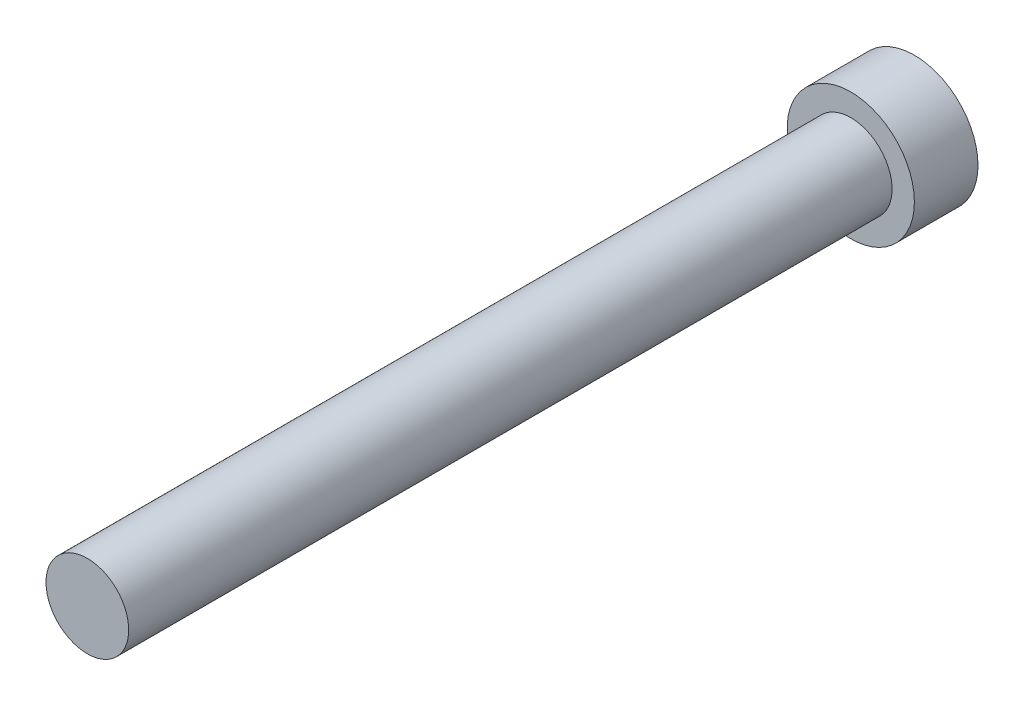
ISO-10303-21;
HEADER;
FILE_DESCRIPTION(('STEP AP214'),'2;1');
FILE_NAME('part.step','',(''),(''),'','','');
FILE_SCHEMA(('AUTOMOTIVE_DESIGN { 1 0 10303 214 1 1 1 1 }'));
ENDSEC;
DATA;
#1=APPLICATION_CONTEXT('core data for automotive mechanical design processes');
#2=APPLICATION_PROTOCOL_DEFINITION('international standard','automotive_design',2000,#1);
#3=PRODUCT_CONTEXT('',#1,'mechanical');
#4=PRODUCT('Part','Part','',(#3));
#5=PRODUCT_RELATED_PRODUCT_CATEGORY('part','',(#4));
#6=PRODUCT_DEFINITION_FORMATION('','',#4);
#7=PRODUCT_DEFINITION_CONTEXT('part definition',#1,'design');
#8=PRODUCT_DEFINITION('design','',#6,#7);
#9=PRODUCT_DEFINITION_SHAPE('','',#8);
#10=(LENGTH_UNIT() NAMED_UNIT(*) SI_UNIT(.MILLI.,.METRE.));
#11=(NAMED_UNIT(*) PLANE_ANGLE_UNIT() SI_UNIT($,.RADIAN.));
#12=(NAMED_UNIT(*) SI_UNIT($,.STERADIAN.) SOLID_ANGLE_UNIT());
#13=UNCERTAINTY_MEASURE_WITH_UNIT(LENGTH_MEASURE(1.E-05),#10,'distance_accuracy_value','');
#14=(GEOMETRIC_REPRESENTATION_CONTEXT(3) GLOBAL_UNCERTAINTY_ASSIGNED_CONTEXT((#13)) GLOBAL_UNIT_ASSIGNED_CONTEXT((#10,
#11,#12)) REPRESENTATION_CONTEXT('',''));
#15=CARTESIAN_POINT('',(0.,0.,0.));
#16=DIRECTION('',(0.,0.,1.));
#17=DIRECTION('',(1.,0.,0.));
#18=AXIS2_PLACEMENT_3D('',#15,#16,#17);
#19=CARTESIAN_POINT('',(0.,0.,2.54));
#20=DIRECTION('',(0.,0.,-1.));
#21=DIRECTION('',(-1.,0.,0.));
#22=AXIS2_PLACEMENT_3D('',#19,#20,#21);
#23=CYLINDRICAL_SURFACE('',#22,2.54);
#24=CARTESIAN_POINT('',(0.,0.,2.54));
#25=DIRECTION('',(0.,0.,1.));
#26=DIRECTION('',(1.,0.,0.));
#27=AXIS2_PLACEMENT_3D('',#24,#25,#26);
#28=CIRCLE('',#27,2.54);
#29=CARTESIAN_POINT('',(2.54,0.,2.54));
#30=VERTEX_POINT('',#29);
#31=EDGE_CURVE('E41',#30,#30,#28,.T.);
#32=ORIENTED_EDGE('',*,*,#31,.F.);
#33=EDGE_LOOP('',(#32));
#34=FACE_BOUND('',#33,.T.);
#35=CARTESIAN_POINT('',(0.,0.,0.));
#36=DIRECTION('',(0.,0.,1.));
#37=DIRECTION('',(1.,0.,0.));
#38=AXIS2_PLACEMENT_3D('',#35,#36,#37);
#39=CIRCLE('',#38,2.54);
#40=CARTESIAN_POINT('',(2.54,0.,0.));
#41=VERTEX_POINT('',#40);
#42=EDGE_CURVE('E37',#41,#41,#39,.T.);
#43=ORIENTED_EDGE('',*,*,#42,.T.);
#44=EDGE_LOOP('',(#43));
#45=FACE_BOUND('',#44,.T.);
#46=ADVANCED_FACE('F34',(#34,#45),#23,.T.);
#47=CARTESIAN_POINT('',(0.,0.,2.54));
#48=DIRECTION('',(0.,0.,1.));
#49=DIRECTION('',(1.,0.,0.));
#50=AXIS2_PLACEMENT_3D('',#47,#48,#49);
#51=PLANE('',#50);
#52=CARTESIAN_POINT('',(0.,0.,2.54));
#53=DIRECTION('',(0.,0.,1.));
#54=DIRECTION('',(1.,0.,0.));
#55=AXIS2_PLACEMENT_3D('',#52,#53,#54);
#56=CIRCLE('',#55,1.651);
#57=CARTESIAN_POINT('',(-1.651,0.,2.54));
#58=VERTEX_POINT('',#57);
#59=EDGE_CURVE('E10',#58,#58,#56,.T.);
#60=ORIENTED_EDGE('',*,*,#59,.F.);
#61=EDGE_LOOP('',(#60));
#62=FACE_BOUND('',#61,.T.);
#63=ORIENTED_EDGE('',*,*,#31,.T.);
#64=EDGE_LOOP('',(#63));
#65=FACE_BOUND('',#64,.T.);
#66=ADVANCED_FACE('F58',(#62,#65),#51,.T.);
#67=CARTESIAN_POINT('',(0.,0.,0.));
#68=DIRECTION('',(0.,0.,1.));
#69=DIRECTION('',(1.,0.,0.));
#70=AXIS2_PLACEMENT_3D('',#67,#68,#69);
#71=PLANE('',#70);
#72=ORIENTED_EDGE('',*,*,#42,.F.);
#73=EDGE_LOOP('',(#72));
#74=FACE_BOUND('',#73,.T.);
#75=ADVANCED_FACE('F55',(#74),#71,.F.);
#76=CARTESIAN_POINT('',(0.,0.,33.02));
#77=DIRECTION('',(0.,0.,-1.));
#78=DIRECTION('',(-1.,0.,0.));
#79=AXIS2_PLACEMENT_3D('',#76,#77,#78);
#80=CYLINDRICAL_SURFACE('',#79,1.651);
#81=CARTESIAN_POINT('',(0.,0.,33.02));
#82=DIRECTION('',(0.,0.,1.));
#83=DIRECTION('',(1.,0.,0.));
#84=AXIS2_PLACEMENT_3D('',#81,#82,#83);
#85=CIRCLE('',#84,1.651);
#86=CARTESIAN_POINT('',(-1.651,0.,33.02));
#87=VERTEX_POINT('',#86);
#88=EDGE_CURVE('E47',#87,#87,#85,.T.);
#89=CARTESIAN_POINT('',(-1.651,0.,33.02));
#90=CARTESIAN_POINT('',(-1.651,0.,32.7025));
#91=CARTESIAN_POINT('',(-1.651,0.,32.385));
#92=CARTESIAN_POINT('',(-1.651,0.,31.75));
#93=CARTESIAN_POINT('',(-1.651,0.,31.4325));
#94=CARTESIAN_POINT('',(-1.651,0.,30.7975));
#95=CARTESIAN_POINT('',(-1.651,0.,30.48));
#96=CARTESIAN_POINT('',(-1.651,0.,29.845));
#97=CARTESIAN_POINT('',(-1.651,0.,29.5275));
#98=CARTESIAN_POINT('',(-1.651,0.,28.8925));
#99=CARTESIAN_POINT('',(-1.651,0.,28.575));
#100=CARTESIAN_POINT('',(-1.651,0.,27.94));
#101=CARTESIAN_POINT('',(-1.651,0.,27.6225));
#102=CARTESIAN_POINT('',(-1.651,0.,26.9875));
#103=CARTESIAN_POINT('',(-1.651,0.,26.67));
#104=CARTESIAN_POINT('',(-1.651,0.,26.035));
#105=CARTESIAN_POINT('',(-1.651,0.,25.7175));
#106=CARTESIAN_POINT('',(-1.651,0.,25.0825));
#107=CARTESIAN_POINT('',(-1.651,0.,24.765));
#108=CARTESIAN_POINT('',(-1.651,0.,24.13));
#109=CARTESIAN_POINT('',(-1.651,0.,23.8125));
#110=CARTESIAN_POINT('',(-1.651,0.,23.1775));
#111=CARTESIAN_POINT('',(-1.651,0.,22.86));
#112=CARTESIAN_POINT('',(-1.651,0.,22.225));
#113=CARTESIAN_POINT('',(-1.651,0.,21.9075));
#114=CARTESIAN_POINT('',(-1.651,0.,21.2725));
#115=CARTESIAN_POINT('',(-1.651,0.,20.955));
#116=CARTESIAN_POINT('',(-1.651,0.,20.32));
#117=CARTESIAN_POINT('',(-1.651,0.,20.0025));
#118=CARTESIAN_POINT('',(-1.651,0.,19.3675));
#119=CARTESIAN_POINT('',(-1.651,0.,19.05));
#120=CARTESIAN_POINT('',(-1.651,0.,18.415));
#121=CARTESIAN_POINT('',(-1.651,0.,18.0975));
#122=CARTESIAN_POINT('',(-1.651,0.,17.4625));
#123=CARTESIAN_POINT('',(-1.651,0.,17.145));
#124=CARTESIAN_POINT('',(-1.651,0.,16.51));
#125=CARTESIAN_POINT('',(-1.651,0.,16.1925));
#126=CARTESIAN_POINT('',(-1.651,0.,15.5575));
#127=CARTESIAN_POINT('',(-1.651,0.,15.24));
#128=CARTESIAN_POINT('',(-1.651,0.,14.605));
#129=CARTESIAN_POINT('',(-1.651,0.,14.2875));
#130=CARTESIAN_POINT('',(-1.651,0.,13.6525));
#131=CARTESIAN_POINT('',(-1.651,0.,13.335));
#132=CARTESIAN_POINT('',(-1.651,0.,12.7));
#133=CARTESIAN_POINT('',(-1.651,0.,12.3825));
#134=CARTESIAN_POINT('',(-1.651,0.,11.7475));
#135=CARTESIAN_POINT('',(-1.651,0.,11.43));
#136=CARTESIAN_POINT('',(-1.651,0.,10.795));
#137=CARTESIAN_POINT('',(-1.651,0.,10.4775));
#138=CARTESIAN_POINT('',(-1.651,0.,9.8425));
#139=CARTESIAN_POINT('',(-1.651,0.,9.525));
#140=CARTESIAN_POINT('',(-1.651,0.,8.89));
#141=CARTESIAN_POINT('',(-1.651,0.,8.57249999999999));
#142=CARTESIAN_POINT('',(-1.651,0.,7.93749999999999));
#143=CARTESIAN_POINT('',(-1.651,0.,7.62));
#144=CARTESIAN_POINT('',(-1.651,0.,6.985));
#145=CARTESIAN_POINT('',(-1.651,0.,6.6675));
#146=CARTESIAN_POINT('',(-1.651,0.,6.0325));
#147=CARTESIAN_POINT('',(-1.651,0.,5.715));
#148=CARTESIAN_POINT('',(-1.651,0.,5.08));
#149=CARTESIAN_POINT('',(-1.651,0.,4.7625));
#150=CARTESIAN_POINT('',(-1.651,0.,4.1275));
#151=CARTESIAN_POINT('',(-1.651,0.,3.81));
#152=CARTESIAN_POINT('',(-1.651,0.,3.175));
#153=CARTESIAN_POINT('',(-1.651,0.,2.8575));
#154=CARTESIAN_POINT('',(-1.651,0.,2.54));
#155=B_SPLINE_CURVE_WITH_KNOTS('',3,(#89,#90,#91,#92,#93,#94,#95,#96,#97,#98,#99,#100,#101,#102,
#103,#104,#105,#106,#107,#108,#109,#110,#111,#112,#113,#114,#115,#116,#117,#118,#119,#120,#121,
#122,#123,#124,#125,#126,#127,#128,#129,#130,#131,#132,#133,#134,#135,#136,#137,#138,#139,#140,
#141,#142,#143,#144,#145,#146,#147,#148,#149,#150,#151,#152,#153,#154),.UNSPECIFIED.,.F.,.F.,(4,
2,2,2,2,2,2,2,2,2,2,2,2,2,2,2,2,2,2,2,2,2,2,2,2,2,2,2,2,2,2,2,4),(0.,0.952499999999995,1.905,
2.8575,3.80999999999999,4.7625,5.71499999999999,6.66749999999999,7.61999999999999,
8.57249999999999,9.52499999999999,10.4775,11.43,12.3825,13.335,14.2875,15.24,16.1925,17.145,
18.0975,19.05,20.0025,20.955,21.9075,22.86,23.8125,24.765,25.7175,26.67,27.6225,28.575,29.5275,
30.48),.UNSPECIFIED.);
#156=EDGE_CURVE('BSEAM57',#87,#58,#155,.T.);
#157=ORIENTED_EDGE('',*,*,#88,.F.);
#158=ORIENTED_EDGE('',*,*,#59,.T.);
#159=ORIENTED_EDGE('',*,*,#156,.T.);
#160=ORIENTED_EDGE('',*,*,#156,.F.);
#161=EDGE_LOOP('',(#157,#159,#158,#160));
#162=FACE_BOUND('',#161,.T.);
#163=ADVANCED_FACE('F57',(#162),#80,.T.);
#164=CARTESIAN_POINT('',(0.,0.,33.02));
#165=DIRECTION('',(0.,0.,1.));
#166=DIRECTION('',(1.,0.,0.));
#167=AXIS2_PLACEMENT_3D('',#164,#165,#166);
#168=PLANE('',#167);
#169=ORIENTED_EDGE('',*,*,#88,.T.);
#170=EDGE_LOOP('',(#169));
#171=FACE_BOUND('',#170,.T.);
#172=ADVANCED_FACE('F63',(#171),#168,.T.);
#173=CLOSED_SHELL('',(#46,#66,#75,#163,#172));
#174=MANIFOLD_SOLID_BREP('B2',#173);
#175=ADVANCED_BREP_SHAPE_REPRESENTATION('',(#18,#174),#14);
#176=SHAPE_DEFINITION_REPRESENTATION(#9,#175);
ENDSEC;
END-ISO-10303-21;
